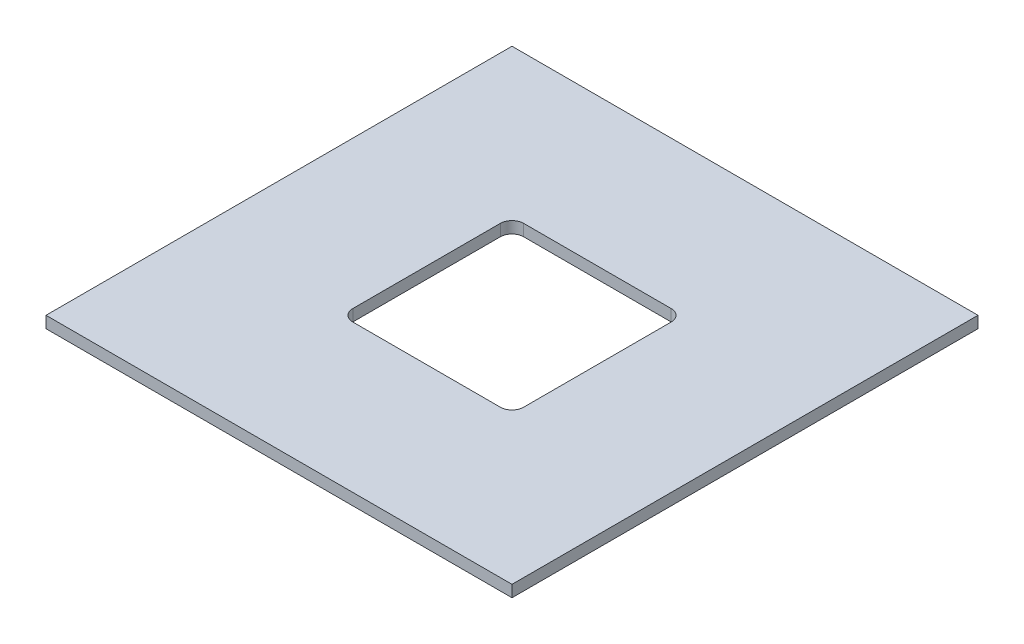
ISO-10303-21;
HEADER;
FILE_DESCRIPTION(('STEP AP214'),'2;1');
FILE_NAME('part.step','',(''),(''),'','','');
FILE_SCHEMA(('AUTOMOTIVE_DESIGN { 1 0 10303 214 1 1 1 1 }'));
ENDSEC;
DATA;
#1=APPLICATION_CONTEXT('core data for automotive mechanical design processes');
#2=APPLICATION_PROTOCOL_DEFINITION('international standard','automotive_design',2000,#1);
#3=PRODUCT_CONTEXT('',#1,'mechanical');
#4=PRODUCT('Part','Part','',(#3));
#5=PRODUCT_RELATED_PRODUCT_CATEGORY('part','',(#4));
#6=PRODUCT_DEFINITION_FORMATION('','',#4);
#7=PRODUCT_DEFINITION_CONTEXT('part definition',#1,'design');
#8=PRODUCT_DEFINITION('design','',#6,#7);
#9=PRODUCT_DEFINITION_SHAPE('','',#8);
#10=(LENGTH_UNIT() NAMED_UNIT(*) SI_UNIT(.MILLI.,.METRE.));
#11=(NAMED_UNIT(*) PLANE_ANGLE_UNIT() SI_UNIT($,.RADIAN.));
#12=(NAMED_UNIT(*) SI_UNIT($,.STERADIAN.) SOLID_ANGLE_UNIT());
#13=UNCERTAINTY_MEASURE_WITH_UNIT(LENGTH_MEASURE(1.E-05),#10,'distance_accuracy_value','');
#14=(GEOMETRIC_REPRESENTATION_CONTEXT(3) GLOBAL_UNCERTAINTY_ASSIGNED_CONTEXT((#13)) GLOBAL_UNIT_ASSIGNED_CONTEXT((#10,
#11,#12)) REPRESENTATION_CONTEXT('',''));
#15=CARTESIAN_POINT('',(0.,0.,0.));
#16=DIRECTION('',(0.,0.,1.));
#17=DIRECTION('',(1.,0.,0.));
#18=AXIS2_PLACEMENT_3D('',#15,#16,#17);
#19=CARTESIAN_POINT('',(0.,3.,0.));
#20=DIRECTION('',(0.,-1.,0.));
#21=DIRECTION('',(0.,0.,-1.));
#22=AXIS2_PLACEMENT_3D('',#19,#20,#21);
#23=PLANE('',#22);
#24=DIRECTION('',(0.,0.,1.));
#25=VECTOR('',#24,1.);
#26=CARTESIAN_POINT('',(-38.,3.,38.));
#27=LINE('',#26,#25);
#28=CARTESIAN_POINT('',(-38.,3.,-82.));
#29=VERTEX_POINT('',#28);
#30=CARTESIAN_POINT('',(-38.,3.,38.));
#31=VERTEX_POINT('',#30);
#32=EDGE_CURVE('E224',#29,#31,#27,.T.);
#33=ORIENTED_EDGE('',*,*,#32,.T.);
#34=DIRECTION('',(1.,0.,0.));
#35=VECTOR('',#34,1.);
#36=CARTESIAN_POINT('',(-38.,3.,38.));
#37=LINE('',#36,#35);
#38=CARTESIAN_POINT('',(82.,3.,38.));
#39=VERTEX_POINT('',#38);
#40=EDGE_CURVE('E228',#31,#39,#37,.T.);
#41=ORIENTED_EDGE('',*,*,#40,.T.);
#42=DIRECTION('',(0.,0.,-1.));
#43=VECTOR('',#42,1.);
#44=CARTESIAN_POINT('',(82.,3.,38.));
#45=LINE('',#44,#43);
#46=CARTESIAN_POINT('',(82.,3.,-82.));
#47=VERTEX_POINT('',#46);
#48=EDGE_CURVE('E232',#39,#47,#45,.T.);
#49=ORIENTED_EDGE('',*,*,#48,.T.);
#50=DIRECTION('',(-1.,0.,0.));
#51=VECTOR('',#50,1.);
#52=CARTESIAN_POINT('',(-38.,3.,-82.));
#53=LINE('',#52,#51);
#54=EDGE_CURVE('E235',#47,#29,#53,.T.);
#55=ORIENTED_EDGE('',*,*,#54,.T.);
#56=EDGE_LOOP('',(#33,#41,#49,#55));
#57=FACE_BOUND('',#56,.T.);
#58=CARTESIAN_POINT('',(3.,3.,-3.));
#59=DIRECTION('',(0.,1.,0.));
#60=DIRECTION('',(0.,0.,-1.));
#61=AXIS2_PLACEMENT_3D('',#58,#59,#60);
#62=CIRCLE('',#61,3.);
#63=CARTESIAN_POINT('',(0.,3.,-3.00000000000002));
#64=VERTEX_POINT('',#63);
#65=CARTESIAN_POINT('',(3.00000000000002,3.,0.));
#66=VERTEX_POINT('',#65);
#67=EDGE_CURVE('E135',#64,#66,#62,.T.);
#68=ORIENTED_EDGE('',*,*,#67,.F.);
#69=DIRECTION('',(0.,0.,1.));
#70=VECTOR('',#69,1.);
#71=CARTESIAN_POINT('',(0.,3.,-3.00000000000002));
#72=LINE('',#71,#70);
#73=CARTESIAN_POINT('',(0.,3.,-41.));
#74=VERTEX_POINT('',#73);
#75=EDGE_CURVE('E176',#74,#64,#72,.T.);
#76=ORIENTED_EDGE('',*,*,#75,.F.);
#77=CARTESIAN_POINT('',(3.,3.,-41.));
#78=DIRECTION('',(0.,1.,0.));
#79=DIRECTION('',(0.,0.,-1.));
#80=AXIS2_PLACEMENT_3D('',#77,#78,#79);
#81=CIRCLE('',#80,3.);
#82=CARTESIAN_POINT('',(3.00000000000002,3.,-44.));
#83=VERTEX_POINT('',#82);
#84=EDGE_CURVE('E173',#83,#74,#81,.T.);
#85=ORIENTED_EDGE('',*,*,#84,.F.);
#86=DIRECTION('',(-1.,0.,0.));
#87=VECTOR('',#86,1.);
#88=CARTESIAN_POINT('',(3.00000000000002,3.,-44.));
#89=LINE('',#88,#87);
#90=CARTESIAN_POINT('',(41.,3.,-44.));
#91=VERTEX_POINT('',#90);
#92=EDGE_CURVE('E170',#91,#83,#89,.T.);
#93=ORIENTED_EDGE('',*,*,#92,.F.);
#94=CARTESIAN_POINT('',(41.,3.,-41.));
#95=DIRECTION('',(0.,1.,0.));
#96=DIRECTION('',(0.,0.,-1.));
#97=AXIS2_PLACEMENT_3D('',#94,#95,#96);
#98=CIRCLE('',#97,3.);
#99=CARTESIAN_POINT('',(44.,3.,-41.));
#100=VERTEX_POINT('',#99);
#101=EDGE_CURVE('E167',#100,#91,#98,.T.);
#102=ORIENTED_EDGE('',*,*,#101,.F.);
#103=DIRECTION('',(0.,0.,-1.));
#104=VECTOR('',#103,1.);
#105=CARTESIAN_POINT('',(44.,3.,-3.00000000000002));
#106=LINE('',#105,#104);
#107=CARTESIAN_POINT('',(44.,3.,-3.00000000000002));
#108=VERTEX_POINT('',#107);
#109=EDGE_CURVE('E162',#108,#100,#106,.T.);
#110=ORIENTED_EDGE('',*,*,#109,.F.);
#111=CARTESIAN_POINT('',(41.,3.,-3.));
#112=DIRECTION('',(0.,1.,0.));
#113=DIRECTION('',(0.,0.,1.));
#114=AXIS2_PLACEMENT_3D('',#111,#112,#113);
#115=CIRCLE('',#114,3.);
#116=CARTESIAN_POINT('',(41.,3.,0.));
#117=VERTEX_POINT('',#116);
#118=EDGE_CURVE('E158',#117,#108,#115,.T.);
#119=ORIENTED_EDGE('',*,*,#118,.F.);
#120=DIRECTION('',(1.,0.,0.));
#121=VECTOR('',#120,1.);
#122=CARTESIAN_POINT('',(3.00000000000002,3.,0.));
#123=LINE('',#122,#121);
#124=EDGE_CURVE('E144',#66,#117,#123,.T.);
#125=ORIENTED_EDGE('',*,*,#124,.F.);
#126=EDGE_LOOP('',(#68,#76,#85,#93,#102,#110,#119,#125));
#127=FACE_BOUND('',#126,.T.);
#128=ADVANCED_FACE('F45',(#57,#127),#23,.F.);
#129=CARTESIAN_POINT('',(0.,0.,0.));
#130=DIRECTION('',(0.,-1.,0.));
#131=DIRECTION('',(0.,0.,-1.));
#132=AXIS2_PLACEMENT_3D('',#129,#130,#131);
#133=PLANE('',#132);
#134=DIRECTION('',(0.,0.,1.));
#135=VECTOR('',#134,1.);
#136=CARTESIAN_POINT('',(-38.,0.,38.));
#137=LINE('',#136,#135);
#138=CARTESIAN_POINT('',(-38.,0.,-82.));
#139=VERTEX_POINT('',#138);
#140=CARTESIAN_POINT('',(-38.,0.,38.));
#141=VERTEX_POINT('',#140);
#142=EDGE_CURVE('E153',#139,#141,#137,.T.);
#143=ORIENTED_EDGE('',*,*,#142,.F.);
#144=DIRECTION('',(-1.,0.,0.));
#145=VECTOR('',#144,1.);
#146=CARTESIAN_POINT('',(-38.,0.,-82.));
#147=LINE('',#146,#145);
#148=CARTESIAN_POINT('',(82.,0.,-82.));
#149=VERTEX_POINT('',#148);
#150=EDGE_CURVE('E229',#149,#139,#147,.T.);
#151=ORIENTED_EDGE('',*,*,#150,.F.);
#152=DIRECTION('',(0.,0.,-1.));
#153=VECTOR('',#152,1.);
#154=CARTESIAN_POINT('',(82.,0.,38.));
#155=LINE('',#154,#153);
#156=CARTESIAN_POINT('',(82.,0.,38.));
#157=VERTEX_POINT('',#156);
#158=EDGE_CURVE('E245',#157,#149,#155,.T.);
#159=ORIENTED_EDGE('',*,*,#158,.F.);
#160=DIRECTION('',(1.,0.,0.));
#161=VECTOR('',#160,1.);
#162=CARTESIAN_POINT('',(-38.,0.,38.));
#163=LINE('',#162,#161);
#164=EDGE_CURVE('E242',#141,#157,#163,.T.);
#165=ORIENTED_EDGE('',*,*,#164,.F.);
#166=EDGE_LOOP('',(#143,#151,#159,#165));
#167=FACE_BOUND('',#166,.T.);
#168=DIRECTION('',(0.,0.,1.));
#169=VECTOR('',#168,1.);
#170=CARTESIAN_POINT('',(0.,0.,-3.00000000000002));
#171=LINE('',#170,#169);
#172=CARTESIAN_POINT('',(0.,0.,-41.));
#173=VERTEX_POINT('',#172);
#174=CARTESIAN_POINT('',(0.,0.,-3.00000000000002));
#175=VERTEX_POINT('',#174);
#176=EDGE_CURVE('E145',#173,#175,#171,.T.);
#177=ORIENTED_EDGE('',*,*,#176,.T.);
#178=CARTESIAN_POINT('',(3.,0.,-3.));
#179=DIRECTION('',(0.,1.,0.));
#180=DIRECTION('',(0.,0.,-1.));
#181=AXIS2_PLACEMENT_3D('',#178,#179,#180);
#182=CIRCLE('',#181,3.);
#183=CARTESIAN_POINT('',(3.00000000000002,0.,0.));
#184=VERTEX_POINT('',#183);
#185=EDGE_CURVE('E69',#175,#184,#182,.T.);
#186=ORIENTED_EDGE('',*,*,#185,.T.);
#187=DIRECTION('',(1.,0.,0.));
#188=VECTOR('',#187,1.);
#189=CARTESIAN_POINT('',(3.00000000000002,0.,0.));
#190=LINE('',#189,#188);
#191=CARTESIAN_POINT('',(41.,0.,0.));
#192=VERTEX_POINT('',#191);
#193=EDGE_CURVE('E151',#184,#192,#190,.T.);
#194=ORIENTED_EDGE('',*,*,#193,.T.);
#195=CARTESIAN_POINT('',(41.,0.,-3.));
#196=DIRECTION('',(0.,1.,0.));
#197=DIRECTION('',(0.,0.,1.));
#198=AXIS2_PLACEMENT_3D('',#195,#196,#197);
#199=CIRCLE('',#198,3.);
#200=CARTESIAN_POINT('',(44.,0.,-3.00000000000002));
#201=VERTEX_POINT('',#200);
#202=EDGE_CURVE('E183',#192,#201,#199,.T.);
#203=ORIENTED_EDGE('',*,*,#202,.T.);
#204=DIRECTION('',(0.,0.,-1.));
#205=VECTOR('',#204,1.);
#206=CARTESIAN_POINT('',(44.,0.,-3.00000000000002));
#207=LINE('',#206,#205);
#208=CARTESIAN_POINT('',(44.,0.,-41.));
#209=VERTEX_POINT('',#208);
#210=EDGE_CURVE('E187',#201,#209,#207,.T.);
#211=ORIENTED_EDGE('',*,*,#210,.T.);
#212=CARTESIAN_POINT('',(41.,0.,-41.));
#213=DIRECTION('',(0.,1.,0.));
#214=DIRECTION('',(0.,0.,-1.));
#215=AXIS2_PLACEMENT_3D('',#212,#213,#214);
#216=CIRCLE('',#215,3.);
#217=CARTESIAN_POINT('',(41.,0.,-44.));
#218=VERTEX_POINT('',#217);
#219=EDGE_CURVE('E191',#209,#218,#216,.T.);
#220=ORIENTED_EDGE('',*,*,#219,.T.);
#221=DIRECTION('',(-1.,0.,0.));
#222=VECTOR('',#221,1.);
#223=CARTESIAN_POINT('',(3.00000000000002,0.,-44.));
#224=LINE('',#223,#222);
#225=CARTESIAN_POINT('',(3.00000000000002,0.,-44.));
#226=VERTEX_POINT('',#225);
#227=EDGE_CURVE('E195',#218,#226,#224,.T.);
#228=ORIENTED_EDGE('',*,*,#227,.T.);
#229=CARTESIAN_POINT('',(3.,0.,-41.));
#230=DIRECTION('',(0.,1.,0.));
#231=DIRECTION('',(0.,0.,-1.));
#232=AXIS2_PLACEMENT_3D('',#229,#230,#231);
#233=CIRCLE('',#232,3.);
#234=EDGE_CURVE('E199',#226,#173,#233,.T.);
#235=ORIENTED_EDGE('',*,*,#234,.T.);
#236=EDGE_LOOP('',(#177,#186,#194,#203,#211,#220,#228,#235));
#237=FACE_BOUND('',#236,.T.);
#238=ADVANCED_FACE('F268',(#167,#237),#133,.T.);
#239=CARTESIAN_POINT('',(-38.,3.,38.));
#240=DIRECTION('',(1.,0.,0.));
#241=DIRECTION('',(0.,0.,-1.));
#242=AXIS2_PLACEMENT_3D('',#239,#240,#241);
#243=PLANE('',#242);
#244=ORIENTED_EDGE('',*,*,#142,.T.);
#245=DIRECTION('',(0.,-1.,0.));
#246=VECTOR('',#245,1.);
#247=CARTESIAN_POINT('',(-38.,3.,38.));
#248=LINE('',#247,#246);
#249=EDGE_CURVE('E11',#31,#141,#248,.T.);
#250=ORIENTED_EDGE('',*,*,#249,.F.);
#251=ORIENTED_EDGE('',*,*,#32,.F.);
#252=DIRECTION('',(0.,-1.,0.));
#253=VECTOR('',#252,1.);
#254=CARTESIAN_POINT('',(-38.,3.,-82.));
#255=LINE('',#254,#253);
#256=EDGE_CURVE('E238',#29,#139,#255,.T.);
#257=ORIENTED_EDGE('',*,*,#256,.T.);
#258=EDGE_LOOP('',(#244,#250,#251,#257));
#259=FACE_BOUND('',#258,.T.);
#260=ADVANCED_FACE('F47',(#259),#243,.F.);
#261=CARTESIAN_POINT('',(-38.,3.,38.));
#262=DIRECTION('',(0.,0.,-1.));
#263=DIRECTION('',(-1.,0.,0.));
#264=AXIS2_PLACEMENT_3D('',#261,#262,#263);
#265=PLANE('',#264);
#266=ORIENTED_EDGE('',*,*,#164,.T.);
#267=DIRECTION('',(0.,-1.,0.));
#268=VECTOR('',#267,1.);
#269=CARTESIAN_POINT('',(82.,3.,38.));
#270=LINE('',#269,#268);
#271=EDGE_CURVE('E54',#39,#157,#270,.T.);
#272=ORIENTED_EDGE('',*,*,#271,.F.);
#273=ORIENTED_EDGE('',*,*,#40,.F.);
#274=ORIENTED_EDGE('',*,*,#249,.T.);
#275=EDGE_LOOP('',(#266,#272,#273,#274));
#276=FACE_BOUND('',#275,.T.);
#277=ADVANCED_FACE('F278',(#276),#265,.F.);
#278=CARTESIAN_POINT('',(82.,3.,38.));
#279=DIRECTION('',(-1.,0.,0.));
#280=DIRECTION('',(0.,0.,1.));
#281=AXIS2_PLACEMENT_3D('',#278,#279,#280);
#282=PLANE('',#281);
#283=ORIENTED_EDGE('',*,*,#158,.T.);
#284=DIRECTION('',(0.,-1.,0.));
#285=VECTOR('',#284,1.);
#286=CARTESIAN_POINT('',(82.,3.,-82.));
#287=LINE('',#286,#285);
#288=EDGE_CURVE('E253',#47,#149,#287,.T.);
#289=ORIENTED_EDGE('',*,*,#288,.F.);
#290=ORIENTED_EDGE('',*,*,#48,.F.);
#291=ORIENTED_EDGE('',*,*,#271,.T.);
#292=EDGE_LOOP('',(#283,#289,#290,#291));
#293=FACE_BOUND('',#292,.T.);
#294=ADVANCED_FACE('F262',(#293),#282,.F.);
#295=CARTESIAN_POINT('',(-38.,3.,-82.));
#296=DIRECTION('',(0.,0.,1.));
#297=DIRECTION('',(1.,0.,0.));
#298=AXIS2_PLACEMENT_3D('',#295,#296,#297);
#299=PLANE('',#298);
#300=ORIENTED_EDGE('',*,*,#150,.T.);
#301=ORIENTED_EDGE('',*,*,#256,.F.);
#302=ORIENTED_EDGE('',*,*,#54,.F.);
#303=ORIENTED_EDGE('',*,*,#288,.T.);
#304=EDGE_LOOP('',(#300,#301,#302,#303));
#305=FACE_BOUND('',#304,.T.);
#306=ADVANCED_FACE('F272',(#305),#299,.F.);
#307=CARTESIAN_POINT('',(3.,3.,-3.));
#308=DIRECTION('',(0.,-1.,0.));
#309=DIRECTION('',(0.,0.,-1.));
#310=AXIS2_PLACEMENT_3D('',#307,#308,#309);
#311=CYLINDRICAL_SURFACE('',#310,3.);
#312=ORIENTED_EDGE('',*,*,#185,.F.);
#313=DIRECTION('',(0.,-1.,0.));
#314=VECTOR('',#313,1.);
#315=CARTESIAN_POINT('',(0.,3.,-3.00000000000002));
#316=LINE('',#315,#314);
#317=EDGE_CURVE('E139',#64,#175,#316,.T.);
#318=ORIENTED_EDGE('',*,*,#317,.F.);
#319=ORIENTED_EDGE('',*,*,#67,.T.);
#320=DIRECTION('',(0.,-1.,0.));
#321=VECTOR('',#320,1.);
#322=CARTESIAN_POINT('',(3.00000000000002,3.,0.));
#323=LINE('',#322,#321);
#324=EDGE_CURVE('E138',#66,#184,#323,.T.);
#325=ORIENTED_EDGE('',*,*,#324,.T.);
#326=EDGE_LOOP('',(#312,#318,#319,#325));
#327=FACE_BOUND('',#326,.T.);
#328=ADVANCED_FACE('F137',(#327),#311,.F.);
#329=CARTESIAN_POINT('',(3.00000000000002,3.,0.));
#330=DIRECTION('',(0.,0.,-1.));
#331=DIRECTION('',(-1.,0.,0.));
#332=AXIS2_PLACEMENT_3D('',#329,#330,#331);
#333=PLANE('',#332);
#334=ORIENTED_EDGE('',*,*,#193,.F.);
#335=ORIENTED_EDGE('',*,*,#324,.F.);
#336=ORIENTED_EDGE('',*,*,#124,.T.);
#337=DIRECTION('',(0.,-1.,0.));
#338=VECTOR('',#337,1.);
#339=CARTESIAN_POINT('',(41.,3.,0.));
#340=LINE('',#339,#338);
#341=EDGE_CURVE('E154',#117,#192,#340,.T.);
#342=ORIENTED_EDGE('',*,*,#341,.T.);
#343=EDGE_LOOP('',(#334,#335,#336,#342));
#344=FACE_BOUND('',#343,.T.);
#345=ADVANCED_FACE('F148',(#344),#333,.T.);
#346=CARTESIAN_POINT('',(41.,3.,-3.));
#347=DIRECTION('',(0.,-1.,0.));
#348=DIRECTION('',(0.,0.,-1.));
#349=AXIS2_PLACEMENT_3D('',#346,#347,#348);
#350=CYLINDRICAL_SURFACE('',#349,3.);
#351=ORIENTED_EDGE('',*,*,#202,.F.);
#352=ORIENTED_EDGE('',*,*,#341,.F.);
#353=ORIENTED_EDGE('',*,*,#118,.T.);
#354=DIRECTION('',(0.,-1.,0.));
#355=VECTOR('',#354,1.);
#356=CARTESIAN_POINT('',(44.,3.,-3.00000000000002));
#357=LINE('',#356,#355);
#358=EDGE_CURVE('E219',#108,#201,#357,.T.);
#359=ORIENTED_EDGE('',*,*,#358,.T.);
#360=EDGE_LOOP('',(#351,#352,#353,#359));
#361=FACE_BOUND('',#360,.T.);
#362=ADVANCED_FACE('F301',(#361),#350,.F.);
#363=CARTESIAN_POINT('',(44.,3.,-3.00000000000002));
#364=DIRECTION('',(-1.,0.,0.));
#365=DIRECTION('',(0.,0.,1.));
#366=AXIS2_PLACEMENT_3D('',#363,#364,#365);
#367=PLANE('',#366);
#368=ORIENTED_EDGE('',*,*,#210,.F.);
#369=ORIENTED_EDGE('',*,*,#358,.F.);
#370=ORIENTED_EDGE('',*,*,#109,.T.);
#371=DIRECTION('',(0.,-1.,0.));
#372=VECTOR('',#371,1.);
#373=CARTESIAN_POINT('',(44.,3.,-41.));
#374=LINE('',#373,#372);
#375=EDGE_CURVE('E216',#100,#209,#374,.T.);
#376=ORIENTED_EDGE('',*,*,#375,.T.);
#377=EDGE_LOOP('',(#368,#369,#370,#376));
#378=FACE_BOUND('',#377,.T.);
#379=ADVANCED_FACE('F305',(#378),#367,.T.);
#380=CARTESIAN_POINT('',(41.,3.,-41.));
#381=DIRECTION('',(0.,-1.,0.));
#382=DIRECTION('',(0.,0.,-1.));
#383=AXIS2_PLACEMENT_3D('',#380,#381,#382);
#384=CYLINDRICAL_SURFACE('',#383,3.);
#385=ORIENTED_EDGE('',*,*,#219,.F.);
#386=ORIENTED_EDGE('',*,*,#375,.F.);
#387=ORIENTED_EDGE('',*,*,#101,.T.);
#388=DIRECTION('',(0.,-1.,0.));
#389=VECTOR('',#388,1.);
#390=CARTESIAN_POINT('',(41.,3.,-44.));
#391=LINE('',#390,#389);
#392=EDGE_CURVE('E213',#91,#218,#391,.T.);
#393=ORIENTED_EDGE('',*,*,#392,.T.);
#394=EDGE_LOOP('',(#385,#386,#387,#393));
#395=FACE_BOUND('',#394,.T.);
#396=ADVANCED_FACE('F311',(#395),#384,.F.);
#397=CARTESIAN_POINT('',(3.00000000000002,3.,-44.));
#398=DIRECTION('',(0.,0.,1.));
#399=DIRECTION('',(1.,0.,0.));
#400=AXIS2_PLACEMENT_3D('',#397,#398,#399);
#401=PLANE('',#400);
#402=ORIENTED_EDGE('',*,*,#227,.F.);
#403=ORIENTED_EDGE('',*,*,#392,.F.);
#404=ORIENTED_EDGE('',*,*,#92,.T.);
#405=DIRECTION('',(0.,-1.,0.));
#406=VECTOR('',#405,1.);
#407=CARTESIAN_POINT('',(3.00000000000002,3.,-44.));
#408=LINE('',#407,#406);
#409=EDGE_CURVE('E210',#83,#226,#408,.T.);
#410=ORIENTED_EDGE('',*,*,#409,.T.);
#411=EDGE_LOOP('',(#402,#403,#404,#410));
#412=FACE_BOUND('',#411,.T.);
#413=ADVANCED_FACE('F315',(#412),#401,.T.);
#414=CARTESIAN_POINT('',(3.,3.,-41.));
#415=DIRECTION('',(0.,-1.,0.));
#416=DIRECTION('',(0.,0.,-1.));
#417=AXIS2_PLACEMENT_3D('',#414,#415,#416);
#418=CYLINDRICAL_SURFACE('',#417,3.);
#419=ORIENTED_EDGE('',*,*,#234,.F.);
#420=ORIENTED_EDGE('',*,*,#409,.F.);
#421=ORIENTED_EDGE('',*,*,#84,.T.);
#422=DIRECTION('',(0.,-1.,0.));
#423=VECTOR('',#422,1.);
#424=CARTESIAN_POINT('',(0.,3.,-41.));
#425=LINE('',#424,#423);
#426=EDGE_CURVE('E61',#74,#173,#425,.T.);
#427=ORIENTED_EDGE('',*,*,#426,.T.);
#428=EDGE_LOOP('',(#419,#420,#421,#427));
#429=FACE_BOUND('',#428,.T.);
#430=ADVANCED_FACE('F319',(#429),#418,.F.);
#431=CARTESIAN_POINT('',(0.,3.,-3.00000000000002));
#432=DIRECTION('',(1.,0.,0.));
#433=DIRECTION('',(0.,0.,-1.));
#434=AXIS2_PLACEMENT_3D('',#431,#432,#433);
#435=PLANE('',#434);
#436=ORIENTED_EDGE('',*,*,#176,.F.);
#437=ORIENTED_EDGE('',*,*,#426,.F.);
#438=ORIENTED_EDGE('',*,*,#75,.T.);
#439=ORIENTED_EDGE('',*,*,#317,.T.);
#440=EDGE_LOOP('',(#436,#437,#438,#439));
#441=FACE_BOUND('',#440,.T.);
#442=ADVANCED_FACE('F323',(#441),#435,.T.);
#443=CLOSED_SHELL('',(#128,#238,#260,#277,#294,#306,#328,#345,#362,#379,#396,#413,#430,#442));
#444=MANIFOLD_SOLID_BREP('B2',#443);
#445=ADVANCED_BREP_SHAPE_REPRESENTATION('',(#18,#444),#14);
#446=SHAPE_DEFINITION_REPRESENTATION(#9,#445);
ENDSEC;
END-ISO-10303-21;
